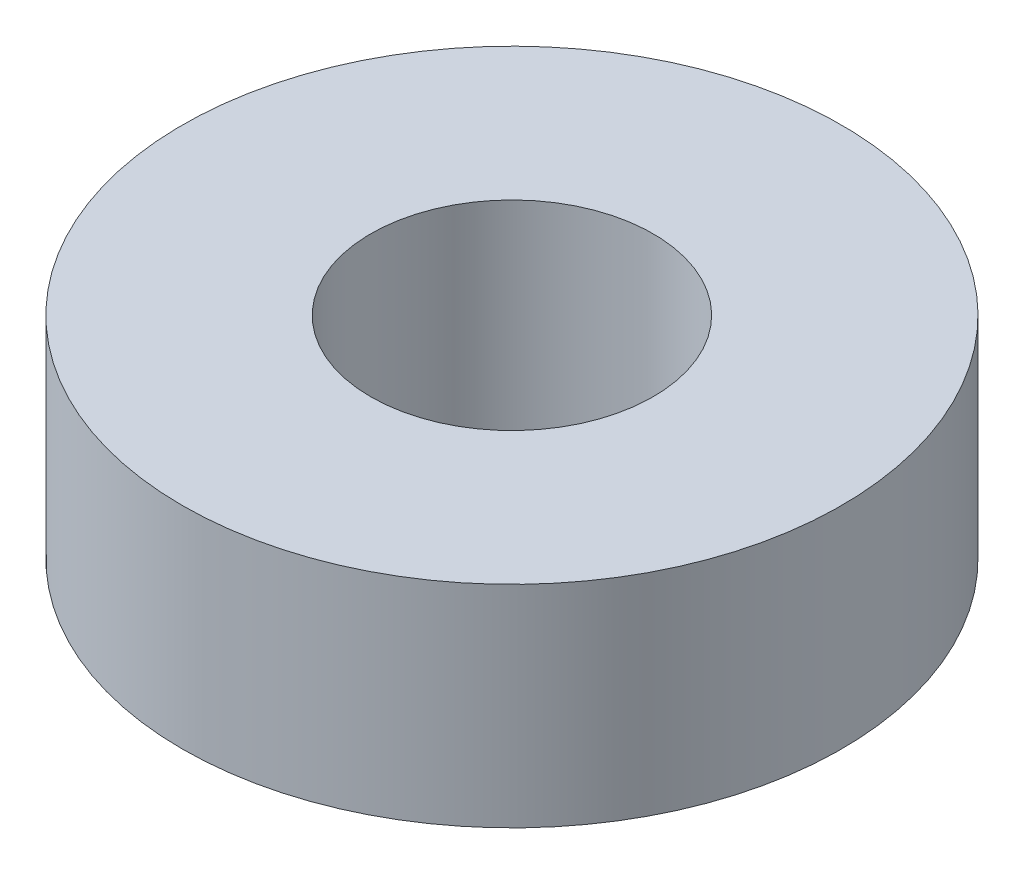
ISO-10303-21;
HEADER;
FILE_DESCRIPTION(('STEP AP214'),'2;1');
FILE_NAME('part.step','',(''),(''),'','','');
FILE_SCHEMA(('AUTOMOTIVE_DESIGN { 1 0 10303 214 1 1 1 1 }'));
ENDSEC;
DATA;
#1=APPLICATION_CONTEXT('core data for automotive mechanical design processes');
#2=APPLICATION_PROTOCOL_DEFINITION('international standard','automotive_design',2000,#1);
#3=PRODUCT_CONTEXT('',#1,'mechanical');
#4=PRODUCT('Part','Part','',(#3));
#5=PRODUCT_RELATED_PRODUCT_CATEGORY('part','',(#4));
#6=PRODUCT_DEFINITION_FORMATION('','',#4);
#7=PRODUCT_DEFINITION_CONTEXT('part definition',#1,'design');
#8=PRODUCT_DEFINITION('design','',#6,#7);
#9=PRODUCT_DEFINITION_SHAPE('','',#8);
#10=(LENGTH_UNIT() NAMED_UNIT(*) SI_UNIT(.MILLI.,.METRE.));
#11=(NAMED_UNIT(*) PLANE_ANGLE_UNIT() SI_UNIT($,.RADIAN.));
#12=(NAMED_UNIT(*) SI_UNIT($,.STERADIAN.) SOLID_ANGLE_UNIT());
#13=UNCERTAINTY_MEASURE_WITH_UNIT(LENGTH_MEASURE(1.E-05),#10,'distance_accuracy_value','');
#14=(GEOMETRIC_REPRESENTATION_CONTEXT(3) GLOBAL_UNCERTAINTY_ASSIGNED_CONTEXT((#13)) GLOBAL_UNIT_ASSIGNED_CONTEXT((#10,
#11,#12)) REPRESENTATION_CONTEXT('',''));
#15=CARTESIAN_POINT('',(0.,0.,0.));
#16=DIRECTION('',(0.,0.,1.));
#17=DIRECTION('',(1.,0.,0.));
#18=AXIS2_PLACEMENT_3D('',#15,#16,#17);
#19=CARTESIAN_POINT('',(0.,7.112,0.));
#20=DIRECTION('',(0.,1.,0.));
#21=DIRECTION('',(0.,0.,1.));
#22=AXIS2_PLACEMENT_3D('',#19,#20,#21);
#23=PLANE('',#22);
#24=CARTESIAN_POINT('',(0.,7.112,0.));
#25=DIRECTION('',(0.,1.,0.));
#26=DIRECTION('',(0.,0.,1.));
#27=AXIS2_PLACEMENT_3D('',#24,#25,#26);
#28=CIRCLE('',#27,11.1125);
#29=CARTESIAN_POINT('',(0.,7.112,11.1125));
#30=VERTEX_POINT('',#29);
#31=EDGE_CURVE('E10',#30,#30,#28,.T.);
#32=ORIENTED_EDGE('',*,*,#31,.T.);
#33=EDGE_LOOP('',(#32));
#34=FACE_BOUND('',#33,.T.);
#35=CARTESIAN_POINT('',(0.,7.112,0.));
#36=DIRECTION('',(0.,1.,0.));
#37=DIRECTION('',(0.,0.,1.));
#38=AXIS2_PLACEMENT_3D('',#35,#36,#37);
#39=CIRCLE('',#38,4.7625);
#40=CARTESIAN_POINT('',(0.,7.112,4.7625));
#41=VERTEX_POINT('',#40);
#42=EDGE_CURVE('E42',#41,#41,#39,.T.);
#43=ORIENTED_EDGE('',*,*,#42,.F.);
#44=EDGE_LOOP('',(#43));
#45=FACE_BOUND('',#44,.T.);
#46=ADVANCED_FACE('F31',(#34,#45),#23,.T.);
#47=CARTESIAN_POINT('',(0.,0.,0.));
#48=DIRECTION('',(0.,1.,0.));
#49=DIRECTION('',(0.,0.,1.));
#50=AXIS2_PLACEMENT_3D('',#47,#48,#49);
#51=PLANE('',#50);
#52=CARTESIAN_POINT('',(0.,0.,0.));
#53=DIRECTION('',(0.,1.,0.));
#54=DIRECTION('',(0.,0.,1.));
#55=AXIS2_PLACEMENT_3D('',#52,#53,#54);
#56=CIRCLE('',#55,11.1125);
#57=CARTESIAN_POINT('',(0.,0.,11.1125));
#58=VERTEX_POINT('',#57);
#59=EDGE_CURVE('E35',#58,#58,#56,.T.);
#60=ORIENTED_EDGE('',*,*,#59,.F.);
#61=EDGE_LOOP('',(#60));
#62=FACE_BOUND('',#61,.T.);
#63=CARTESIAN_POINT('',(0.,0.,0.));
#64=DIRECTION('',(0.,1.,0.));
#65=DIRECTION('',(0.,0.,1.));
#66=AXIS2_PLACEMENT_3D('',#63,#64,#65);
#67=CIRCLE('',#66,4.7625);
#68=CARTESIAN_POINT('',(0.,0.,4.7625));
#69=VERTEX_POINT('',#68);
#70=EDGE_CURVE('E44',#69,#69,#67,.T.);
#71=ORIENTED_EDGE('',*,*,#70,.T.);
#72=EDGE_LOOP('',(#71));
#73=FACE_BOUND('',#72,.T.);
#74=ADVANCED_FACE('F54',(#62,#73),#51,.F.);
#75=CARTESIAN_POINT('',(0.,7.112,0.));
#76=DIRECTION('',(0.,-1.,0.));
#77=DIRECTION('',(0.,0.,-1.));
#78=AXIS2_PLACEMENT_3D('',#75,#76,#77);
#79=CYLINDRICAL_SURFACE('',#78,11.1125);
#80=ORIENTED_EDGE('',*,*,#31,.F.);
#81=EDGE_LOOP('',(#80));
#82=FACE_BOUND('',#81,.T.);
#83=ORIENTED_EDGE('',*,*,#59,.T.);
#84=EDGE_LOOP('',(#83));
#85=FACE_BOUND('',#84,.T.);
#86=ADVANCED_FACE('F33',(#82,#85),#79,.T.);
#87=CARTESIAN_POINT('',(0.,7.112,0.));
#88=DIRECTION('',(0.,-1.,0.));
#89=DIRECTION('',(0.,0.,-1.));
#90=AXIS2_PLACEMENT_3D('',#87,#88,#89);
#91=CYLINDRICAL_SURFACE('',#90,4.7625);
#92=ORIENTED_EDGE('',*,*,#42,.T.);
#93=EDGE_LOOP('',(#92));
#94=FACE_BOUND('',#93,.T.);
#95=ORIENTED_EDGE('',*,*,#70,.F.);
#96=EDGE_LOOP('',(#95));
#97=FACE_BOUND('',#96,.T.);
#98=ADVANCED_FACE('F50',(#94,#97),#91,.F.);
#99=CLOSED_SHELL('',(#46,#74,#86,#98));
#100=MANIFOLD_SOLID_BREP('B2',#99);
#101=ADVANCED_BREP_SHAPE_REPRESENTATION('',(#18,#100),#14);
#102=SHAPE_DEFINITION_REPRESENTATION(#9,#101);
ENDSEC;
END-ISO-10303-21;
